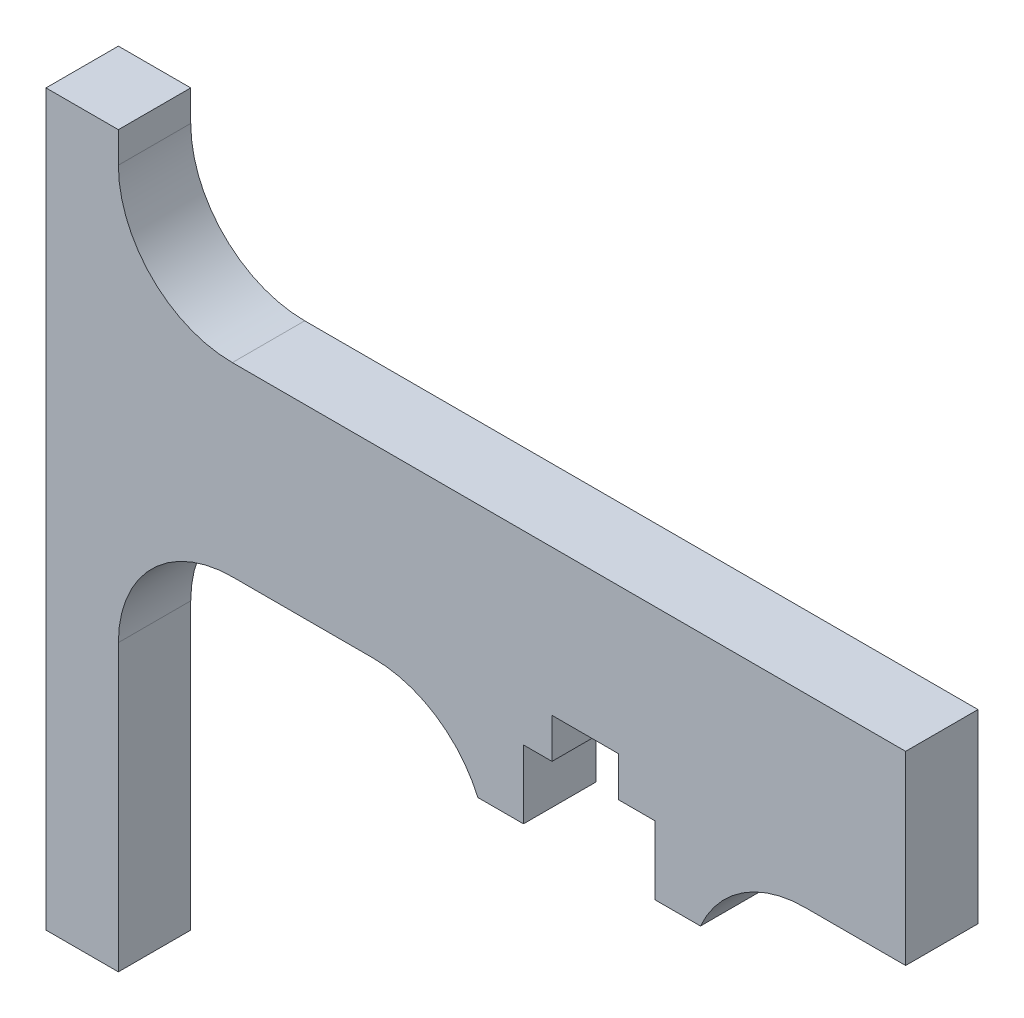
ISO-10303-21;
HEADER;
FILE_DESCRIPTION(('STEP AP214'),'2;1');
FILE_NAME('part.step','',(''),(''),'','','');
FILE_SCHEMA(('AUTOMOTIVE_DESIGN { 1 0 10303 214 1 1 1 1 }'));
ENDSEC;
DATA;
#1=APPLICATION_CONTEXT('core data for automotive mechanical design processes');
#2=APPLICATION_PROTOCOL_DEFINITION('international standard','automotive_design',2000,#1);
#3=PRODUCT_CONTEXT('',#1,'mechanical');
#4=PRODUCT('Part','Part','',(#3));
#5=PRODUCT_RELATED_PRODUCT_CATEGORY('part','',(#4));
#6=PRODUCT_DEFINITION_FORMATION('','',#4);
#7=PRODUCT_DEFINITION_CONTEXT('part definition',#1,'design');
#8=PRODUCT_DEFINITION('design','',#6,#7);
#9=PRODUCT_DEFINITION_SHAPE('','',#8);
#10=(LENGTH_UNIT() NAMED_UNIT(*) SI_UNIT(.MILLI.,.METRE.));
#11=(NAMED_UNIT(*) PLANE_ANGLE_UNIT() SI_UNIT($,.RADIAN.));
#12=(NAMED_UNIT(*) SI_UNIT($,.STERADIAN.) SOLID_ANGLE_UNIT());
#13=UNCERTAINTY_MEASURE_WITH_UNIT(LENGTH_MEASURE(1.E-05),#10,'distance_accuracy_value','');
#14=(GEOMETRIC_REPRESENTATION_CONTEXT(3) GLOBAL_UNCERTAINTY_ASSIGNED_CONTEXT((#13)) GLOBAL_UNIT_ASSIGNED_CONTEXT((#10,
#11,#12)) REPRESENTATION_CONTEXT('',''));
#15=CARTESIAN_POINT('',(0.,0.,0.));
#16=DIRECTION('',(0.,0.,1.));
#17=DIRECTION('',(1.,0.,0.));
#18=AXIS2_PLACEMENT_3D('',#15,#16,#17);
#19=CARTESIAN_POINT('',(75.42710801,-28.978,6.35));
#20=DIRECTION('',(0.,1.,0.));
#21=DIRECTION('',(-1.,0.,0.));
#22=AXIS2_PLACEMENT_3D('',#19,#20,#21);
#23=PLANE('',#22);
#24=DIRECTION('',(1.,0.,0.));
#25=VECTOR('',#24,1.);
#26=CARTESIAN_POINT('',(75.42710801,-28.978,6.35));
#27=LINE('',#26,#25);
#28=CARTESIAN_POINT('',(50.25060801,-28.978,6.35));
#29=VERTEX_POINT('',#28);
#30=CARTESIAN_POINT('',(53.42710801,-28.978,6.35));
#31=VERTEX_POINT('',#30);
#32=EDGE_CURVE('E200',#29,#31,#27,.T.);
#33=ORIENTED_EDGE('',*,*,#32,.F.);
#34=DIRECTION('',(0.,0.,-1.));
#35=VECTOR('',#34,1.);
#36=CARTESIAN_POINT('',(50.25060801,-28.978,10.));
#37=LINE('',#36,#35);
#38=CARTESIAN_POINT('',(50.25060801,-28.978,0.));
#39=VERTEX_POINT('',#38);
#40=EDGE_CURVE('E185',#29,#39,#37,.T.);
#41=ORIENTED_EDGE('',*,*,#40,.T.);
#42=DIRECTION('',(1.,0.,0.));
#43=VECTOR('',#42,1.);
#44=CARTESIAN_POINT('',(75.42710801,-28.978,0.));
#45=LINE('',#44,#43);
#46=CARTESIAN_POINT('',(53.42710801,-28.978,0.));
#47=VERTEX_POINT('',#46);
#48=EDGE_CURVE('E198',#39,#47,#45,.T.);
#49=ORIENTED_EDGE('',*,*,#48,.T.);
#50=DIRECTION('',(0.,0.,-1.));
#51=VECTOR('',#50,1.);
#52=CARTESIAN_POINT('',(53.42710801,-28.978,6.35));
#53=LINE('',#52,#51);
#54=EDGE_CURVE('E591',#31,#47,#53,.T.);
#55=ORIENTED_EDGE('',*,*,#54,.F.);
#56=EDGE_LOOP('',(#33,#41,#49,#55));
#57=FACE_BOUND('',#56,.T.);
#58=ADVANCED_FACE('F32',(#57),#23,.F.);
#59=CARTESIAN_POINT('',(41.89710801,-28.978,0.));
#60=VERTEX_POINT('',#59);
#61=CARTESIAN_POINT('',(44.40060801,-28.978,0.));
#62=VERTEX_POINT('',#61);
#63=EDGE_CURVE('E208',#60,#62,#45,.T.);
#64=ORIENTED_EDGE('',*,*,#63,.T.);
#65=DIRECTION('',(0.,0.,-1.));
#66=VECTOR('',#65,1.);
#67=CARTESIAN_POINT('',(44.40060801,-28.978,10.));
#68=LINE('',#67,#66);
#69=CARTESIAN_POINT('',(44.40060801,-28.978,6.35));
#70=VERTEX_POINT('',#69);
#71=EDGE_CURVE('E47',#70,#62,#68,.T.);
#72=ORIENTED_EDGE('',*,*,#71,.F.);
#73=CARTESIAN_POINT('',(41.89710801,-28.978,6.35));
#74=VERTEX_POINT('',#73);
#75=EDGE_CURVE('E312',#74,#70,#27,.T.);
#76=ORIENTED_EDGE('',*,*,#75,.F.);
#77=DIRECTION('',(0.,0.,-1.));
#78=VECTOR('',#77,1.);
#79=CARTESIAN_POINT('',(41.89710801,-28.978,6.35));
#80=LINE('',#79,#78);
#81=EDGE_CURVE('E294',#74,#60,#80,.T.);
#82=ORIENTED_EDGE('',*,*,#81,.T.);
#83=EDGE_LOOP('',(#64,#72,#76,#82));
#84=FACE_BOUND('',#83,.T.);
#85=ADVANCED_FACE('F338',(#84),#23,.F.);
#86=CARTESIAN_POINT('',(16.35,-28.978,0.));
#87=VERTEX_POINT('',#86);
#88=CARTESIAN_POINT('',(28.7319566200883,-28.978,0.));
#89=VERTEX_POINT('',#88);
#90=EDGE_CURVE('E211',#87,#89,#45,.T.);
#91=ORIENTED_EDGE('',*,*,#90,.T.);
#92=DIRECTION('',(0.,0.,1.));
#93=VECTOR('',#92,1.);
#94=CARTESIAN_POINT('',(28.7319566200883,-28.978,6.35));
#95=LINE('',#94,#93);
#96=CARTESIAN_POINT('',(28.7319566200883,-28.978,6.35));
#97=VERTEX_POINT('',#96);
#98=EDGE_CURVE('E55',#89,#97,#95,.T.);
#99=ORIENTED_EDGE('',*,*,#98,.T.);
#100=CARTESIAN_POINT('',(16.35,-28.978,6.35));
#101=VERTEX_POINT('',#100);
#102=EDGE_CURVE('E309',#101,#97,#27,.T.);
#103=ORIENTED_EDGE('',*,*,#102,.F.);
#104=DIRECTION('',(0.,0.,-1.));
#105=VECTOR('',#104,1.);
#106=CARTESIAN_POINT('',(16.35,-28.978,0.));
#107=LINE('',#106,#105);
#108=EDGE_CURVE('E257',#101,#87,#107,.T.);
#109=ORIENTED_EDGE('',*,*,#108,.T.);
#110=EDGE_LOOP('',(#91,#99,#103,#109));
#111=FACE_BOUND('',#110,.T.);
#112=ADVANCED_FACE('F335',(#111),#23,.F.);
#113=CARTESIAN_POINT('',(6.35000000000002,-63.9998,6.35));
#114=DIRECTION('',(0.,1.,0.));
#115=DIRECTION('',(0.,0.,1.));
#116=AXIS2_PLACEMENT_3D('',#113,#114,#115);
#117=PLANE('',#116);
#118=DIRECTION('',(1.,0.,0.));
#119=VECTOR('',#118,1.);
#120=CARTESIAN_POINT('',(6.35000000000002,-63.9998,0.));
#121=LINE('',#120,#119);
#122=CARTESIAN_POINT('',(0.,-63.9998,0.));
#123=VERTEX_POINT('',#122);
#124=CARTESIAN_POINT('',(6.35000000000002,-63.9998,0.));
#125=VERTEX_POINT('',#124);
#126=EDGE_CURVE('E290',#123,#125,#121,.T.);
#127=ORIENTED_EDGE('',*,*,#126,.T.);
#128=DIRECTION('',(0.,0.,-1.));
#129=VECTOR('',#128,1.);
#130=CARTESIAN_POINT('',(6.35000000000002,-63.9998,6.35));
#131=LINE('',#130,#129);
#132=CARTESIAN_POINT('',(6.35000000000002,-63.9998,6.35));
#133=VERTEX_POINT('',#132);
#134=EDGE_CURVE('E246',#133,#125,#131,.T.);
#135=ORIENTED_EDGE('',*,*,#134,.F.);
#136=DIRECTION('',(1.,0.,0.));
#137=VECTOR('',#136,1.);
#138=CARTESIAN_POINT('',(6.35000000000002,-63.9998,6.35));
#139=LINE('',#138,#137);
#140=CARTESIAN_POINT('',(0.,-63.9998,6.35));
#141=VERTEX_POINT('',#140);
#142=EDGE_CURVE('E303',#141,#133,#139,.T.);
#143=ORIENTED_EDGE('',*,*,#142,.F.);
#144=DIRECTION('',(0.,0.,-1.));
#145=VECTOR('',#144,1.);
#146=CARTESIAN_POINT('',(0.,-63.9998,6.35));
#147=LINE('',#146,#145);
#148=EDGE_CURVE('E249',#141,#123,#147,.T.);
#149=ORIENTED_EDGE('',*,*,#148,.T.);
#150=EDGE_LOOP('',(#127,#135,#143,#149));
#151=FACE_BOUND('',#150,.T.);
#152=ADVANCED_FACE('F337',(#151),#117,.F.);
#153=CARTESIAN_POINT('',(6.35,-28.978,6.35));
#154=DIRECTION('',(-1.,0.,0.));
#155=DIRECTION('',(0.,-1.,0.));
#156=AXIS2_PLACEMENT_3D('',#153,#154,#155);
#157=PLANE('',#156);
#158=DIRECTION('',(0.,1.,0.));
#159=VECTOR('',#158,1.);
#160=CARTESIAN_POINT('',(6.35,-28.978,0.));
#161=LINE('',#160,#159);
#162=CARTESIAN_POINT('',(6.35000000000001,-38.978,0.));
#163=VERTEX_POINT('',#162);
#164=EDGE_CURVE('E213',#125,#163,#161,.T.);
#165=ORIENTED_EDGE('',*,*,#164,.T.);
#166=DIRECTION('',(0.,0.,-1.));
#167=VECTOR('',#166,1.);
#168=CARTESIAN_POINT('',(6.35000000000001,-38.978,6.35));
#169=LINE('',#168,#167);
#170=CARTESIAN_POINT('',(6.35000000000001,-38.978,6.35));
#171=VERTEX_POINT('',#170);
#172=EDGE_CURVE('E259',#163,#171,#169,.F.);
#173=ORIENTED_EDGE('',*,*,#172,.T.);
#174=DIRECTION('',(0.,1.,0.));
#175=VECTOR('',#174,1.);
#176=CARTESIAN_POINT('',(6.35,-28.978,6.35));
#177=LINE('',#176,#175);
#178=EDGE_CURVE('E305',#133,#171,#177,.T.);
#179=ORIENTED_EDGE('',*,*,#178,.F.);
#180=ORIENTED_EDGE('',*,*,#134,.T.);
#181=EDGE_LOOP('',(#165,#173,#179,#180));
#182=FACE_BOUND('',#181,.T.);
#183=ADVANCED_FACE('F324',(#182),#157,.F.);
#184=CARTESIAN_POINT('',(66.5922593999117,-28.978,6.35));
#185=VERTEX_POINT('',#184);
#186=CARTESIAN_POINT('',(75.42710801,-28.978,6.35));
#187=VERTEX_POINT('',#186);
#188=EDGE_CURVE('E308',#185,#187,#27,.T.);
#189=ORIENTED_EDGE('',*,*,#188,.F.);
#190=DIRECTION('',(0.,0.,-1.));
#191=VECTOR('',#190,1.);
#192=CARTESIAN_POINT('',(66.5922593999117,-28.978,6.35));
#193=LINE('',#192,#191);
#194=CARTESIAN_POINT('',(66.5922593999117,-28.978,0.));
#195=VERTEX_POINT('',#194);
#196=EDGE_CURVE('E269',#185,#195,#193,.T.);
#197=ORIENTED_EDGE('',*,*,#196,.T.);
#198=CARTESIAN_POINT('',(75.42710801,-28.978,0.));
#199=VERTEX_POINT('',#198);
#200=EDGE_CURVE('E209',#195,#199,#45,.T.);
#201=ORIENTED_EDGE('',*,*,#200,.T.);
#202=DIRECTION('',(0.,0.,-1.));
#203=VECTOR('',#202,1.);
#204=CARTESIAN_POINT('',(75.42710801,-28.978,6.35));
#205=LINE('',#204,#203);
#206=EDGE_CURVE('E244',#187,#199,#205,.T.);
#207=ORIENTED_EDGE('',*,*,#206,.F.);
#208=EDGE_LOOP('',(#189,#197,#201,#207));
#209=FACE_BOUND('',#208,.T.);
#210=ADVANCED_FACE('F340',(#209),#23,.F.);
#211=CARTESIAN_POINT('',(75.42710801,-12.7,6.35));
#212=DIRECTION('',(-1.,0.,0.));
#213=DIRECTION('',(0.,-1.,0.));
#214=AXIS2_PLACEMENT_3D('',#211,#212,#213);
#215=PLANE('',#214);
#216=DIRECTION('',(0.,1.,0.));
#217=VECTOR('',#216,1.);
#218=CARTESIAN_POINT('',(75.42710801,-12.7,0.));
#219=LINE('',#218,#217);
#220=CARTESIAN_POINT('',(75.42710801,-12.7,0.));
#221=VERTEX_POINT('',#220);
#222=EDGE_CURVE('E216',#199,#221,#219,.T.);
#223=ORIENTED_EDGE('',*,*,#222,.T.);
#224=DIRECTION('',(0.,0.,-1.));
#225=VECTOR('',#224,1.);
#226=CARTESIAN_POINT('',(75.42710801,-12.7,6.35));
#227=LINE('',#226,#225);
#228=CARTESIAN_POINT('',(75.42710801,-12.7,6.35));
#229=VERTEX_POINT('',#228);
#230=EDGE_CURVE('E242',#229,#221,#227,.T.);
#231=ORIENTED_EDGE('',*,*,#230,.F.);
#232=DIRECTION('',(0.,1.,0.));
#233=VECTOR('',#232,1.);
#234=CARTESIAN_POINT('',(75.42710801,-12.7,6.35));
#235=LINE('',#234,#233);
#236=EDGE_CURVE('E311',#187,#229,#235,.T.);
#237=ORIENTED_EDGE('',*,*,#236,.F.);
#238=ORIENTED_EDGE('',*,*,#206,.T.);
#239=EDGE_LOOP('',(#223,#231,#237,#238));
#240=FACE_BOUND('',#239,.T.);
#241=ADVANCED_FACE('F352',(#240),#215,.F.);
#242=CARTESIAN_POINT('',(6.34999999999999,-12.7,6.35));
#243=DIRECTION('',(0.,-1.,0.));
#244=DIRECTION('',(1.,0.,0.));
#245=AXIS2_PLACEMENT_3D('',#242,#243,#244);
#246=PLANE('',#245);
#247=DIRECTION('',(-1.,0.,0.));
#248=VECTOR('',#247,1.);
#249=CARTESIAN_POINT('',(6.34999999999999,-12.7,0.));
#250=LINE('',#249,#248);
#251=CARTESIAN_POINT('',(16.35,-12.7,0.));
#252=VERTEX_POINT('',#251);
#253=EDGE_CURVE('E219',#221,#252,#250,.T.);
#254=ORIENTED_EDGE('',*,*,#253,.T.);
#255=DIRECTION('',(0.,0.,-1.));
#256=VECTOR('',#255,1.);
#257=CARTESIAN_POINT('',(16.35,-12.7,6.35));
#258=LINE('',#257,#256);
#259=CARTESIAN_POINT('',(16.35,-12.7,6.35));
#260=VERTEX_POINT('',#259);
#261=EDGE_CURVE('E255',#252,#260,#258,.F.);
#262=ORIENTED_EDGE('',*,*,#261,.T.);
#263=DIRECTION('',(-1.,0.,0.));
#264=VECTOR('',#263,1.);
#265=CARTESIAN_POINT('',(6.34999999999999,-12.7,6.35));
#266=LINE('',#265,#264);
#267=EDGE_CURVE('E314',#229,#260,#266,.T.);
#268=ORIENTED_EDGE('',*,*,#267,.F.);
#269=ORIENTED_EDGE('',*,*,#230,.T.);
#270=EDGE_LOOP('',(#254,#262,#268,#269));
#271=FACE_BOUND('',#270,.T.);
#272=ADVANCED_FACE('F444',(#271),#246,.F.);
#273=CARTESIAN_POINT('',(6.34999999999999,0.,6.35));
#274=DIRECTION('',(-1.,0.,0.));
#275=DIRECTION('',(0.,-1.,0.));
#276=AXIS2_PLACEMENT_3D('',#273,#274,#275);
#277=PLANE('',#276);
#278=DIRECTION('',(0.,1.,0.));
#279=VECTOR('',#278,1.);
#280=CARTESIAN_POINT('',(6.34999999999999,0.,6.35));
#281=LINE('',#280,#279);
#282=CARTESIAN_POINT('',(6.34999999999999,-2.7,6.35));
#283=VERTEX_POINT('',#282);
#284=CARTESIAN_POINT('',(6.34999999999999,0.,6.35));
#285=VERTEX_POINT('',#284);
#286=EDGE_CURVE('E317',#283,#285,#281,.T.);
#287=ORIENTED_EDGE('',*,*,#286,.F.);
#288=DIRECTION('',(0.,0.,-1.));
#289=VECTOR('',#288,1.);
#290=CARTESIAN_POINT('',(6.34999999999999,-2.7,0.));
#291=LINE('',#290,#289);
#292=CARTESIAN_POINT('',(6.34999999999999,-2.7,0.));
#293=VERTEX_POINT('',#292);
#294=EDGE_CURVE('E252',#283,#293,#291,.T.);
#295=ORIENTED_EDGE('',*,*,#294,.T.);
#296=DIRECTION('',(0.,1.,0.));
#297=VECTOR('',#296,1.);
#298=CARTESIAN_POINT('',(6.34999999999999,0.,0.));
#299=LINE('',#298,#297);
#300=CARTESIAN_POINT('',(6.34999999999999,0.,0.));
#301=VERTEX_POINT('',#300);
#302=EDGE_CURVE('E226',#293,#301,#299,.T.);
#303=ORIENTED_EDGE('',*,*,#302,.T.);
#304=DIRECTION('',(0.,0.,-1.));
#305=VECTOR('',#304,1.);
#306=CARTESIAN_POINT('',(6.34999999999999,0.,6.35));
#307=LINE('',#306,#305);
#308=EDGE_CURVE('E238',#285,#301,#307,.T.);
#309=ORIENTED_EDGE('',*,*,#308,.F.);
#310=EDGE_LOOP('',(#287,#295,#303,#309));
#311=FACE_BOUND('',#310,.T.);
#312=ADVANCED_FACE('F440',(#311),#277,.F.);
#313=CARTESIAN_POINT('',(0.,0.,6.35));
#314=DIRECTION('',(0.,-1.,0.));
#315=DIRECTION('',(0.,0.,-1.));
#316=AXIS2_PLACEMENT_3D('',#313,#314,#315);
#317=PLANE('',#316);
#318=DIRECTION('',(-1.,0.,0.));
#319=VECTOR('',#318,1.);
#320=CARTESIAN_POINT('',(0.,0.,0.));
#321=LINE('',#320,#319);
#322=CARTESIAN_POINT('',(0.,0.,0.));
#323=VERTEX_POINT('',#322);
#324=EDGE_CURVE('E230',#301,#323,#321,.T.);
#325=ORIENTED_EDGE('',*,*,#324,.T.);
#326=DIRECTION('',(0.,0.,-1.));
#327=VECTOR('',#326,1.);
#328=CARTESIAN_POINT('',(0.,0.,6.35));
#329=LINE('',#328,#327);
#330=CARTESIAN_POINT('',(0.,0.,6.35));
#331=VERTEX_POINT('',#330);
#332=EDGE_CURVE('E235',#331,#323,#329,.T.);
#333=ORIENTED_EDGE('',*,*,#332,.F.);
#334=DIRECTION('',(-1.,0.,0.));
#335=VECTOR('',#334,1.);
#336=CARTESIAN_POINT('',(0.,0.,6.35));
#337=LINE('',#336,#335);
#338=EDGE_CURVE('E239',#285,#331,#337,.T.);
#339=ORIENTED_EDGE('',*,*,#338,.F.);
#340=ORIENTED_EDGE('',*,*,#308,.T.);
#341=EDGE_LOOP('',(#325,#333,#339,#340));
#342=FACE_BOUND('',#341,.T.);
#343=ADVANCED_FACE('F436',(#342),#317,.F.);
#344=CARTESIAN_POINT('',(0.,-45.001477479758,6.35));
#345=DIRECTION('',(1.,0.,0.));
#346=DIRECTION('',(0.,0.,-1.));
#347=AXIS2_PLACEMENT_3D('',#344,#345,#346);
#348=PLANE('',#347);
#349=DIRECTION('',(0.,-1.,0.));
#350=VECTOR('',#349,1.);
#351=CARTESIAN_POINT('',(0.,-45.001477479758,0.));
#352=LINE('',#351,#350);
#353=EDGE_CURVE('E232',#323,#123,#352,.T.);
#354=ORIENTED_EDGE('',*,*,#353,.T.);
#355=ORIENTED_EDGE('',*,*,#148,.F.);
#356=DIRECTION('',(0.,-1.,0.));
#357=VECTOR('',#356,1.);
#358=CARTESIAN_POINT('',(0.,-63.9998,6.35));
#359=LINE('',#358,#357);
#360=EDGE_CURVE('E234',#331,#141,#359,.T.);
#361=ORIENTED_EDGE('',*,*,#360,.F.);
#362=ORIENTED_EDGE('',*,*,#332,.T.);
#363=EDGE_LOOP('',(#354,#355,#361,#362));
#364=FACE_BOUND('',#363,.T.);
#365=ADVANCED_FACE('F375',(#364),#348,.F.);
#366=CARTESIAN_POINT('',(0.,0.,6.35));
#367=DIRECTION('',(0.,0.,-1.));
#368=DIRECTION('',(-1.,0.,0.));
#369=AXIS2_PLACEMENT_3D('',#366,#367,#368);
#370=PLANE('',#369);
#371=DIRECTION('',(1.,0.,0.));
#372=VECTOR('',#371,1.);
#373=CARTESIAN_POINT('',(0.,-25.478,6.35));
#374=LINE('',#373,#372);
#375=CARTESIAN_POINT('',(44.40060801,-25.478,6.35));
#376=VERTEX_POINT('',#375);
#377=CARTESIAN_POINT('',(50.25060801,-25.478,6.35));
#378=VERTEX_POINT('',#377);
#379=EDGE_CURVE('E603',#376,#378,#374,.T.);
#380=ORIENTED_EDGE('',*,*,#379,.T.);
#381=DIRECTION('',(0.,-1.,0.));
#382=VECTOR('',#381,1.);
#383=CARTESIAN_POINT('',(50.25060801,0.,6.35));
#384=LINE('',#383,#382);
#385=EDGE_CURVE('E598',#378,#29,#384,.T.);
#386=ORIENTED_EDGE('',*,*,#385,.T.);
#387=ORIENTED_EDGE('',*,*,#32,.T.);
#388=DIRECTION('',(0.,1.,0.));
#389=VECTOR('',#388,1.);
#390=CARTESIAN_POINT('',(53.42710801,-28.978,6.35));
#391=LINE('',#390,#389);
#392=CARTESIAN_POINT('',(53.42710801,-34.978,6.35));
#393=VERTEX_POINT('',#392);
#394=EDGE_CURVE('E596',#393,#31,#391,.T.);
#395=ORIENTED_EDGE('',*,*,#394,.F.);
#396=DIRECTION('',(-1.,0.,0.));
#397=VECTOR('',#396,1.);
#398=CARTESIAN_POINT('',(53.42710801,-34.978,6.35));
#399=LINE('',#398,#397);
#400=CARTESIAN_POINT('',(57.42710801,-34.978,6.35));
#401=VERTEX_POINT('',#400);
#402=EDGE_CURVE('E574',#401,#393,#399,.T.);
#403=ORIENTED_EDGE('',*,*,#402,.F.);
#404=CARTESIAN_POINT('',(66.5922593999117,-38.978,6.35));
#405=DIRECTION('',(0.,0.,-1.));
#406=DIRECTION('',(-1.,0.,0.));
#407=AXIS2_PLACEMENT_3D('',#404,#405,#406);
#408=CIRCLE('',#407,10.);
#409=EDGE_CURVE('E275',#401,#185,#408,.T.);
#410=ORIENTED_EDGE('',*,*,#409,.T.);
#411=ORIENTED_EDGE('',*,*,#188,.T.);
#412=ORIENTED_EDGE('',*,*,#236,.T.);
#413=ORIENTED_EDGE('',*,*,#267,.T.);
#414=CARTESIAN_POINT('',(16.35,-2.7,6.35));
#415=DIRECTION('',(0.,0.,-1.));
#416=DIRECTION('',(-1.,0.,0.));
#417=AXIS2_PLACEMENT_3D('',#414,#415,#416);
#418=CIRCLE('',#417,10.);
#419=EDGE_CURVE('E263',#260,#283,#418,.T.);
#420=ORIENTED_EDGE('',*,*,#419,.T.);
#421=ORIENTED_EDGE('',*,*,#286,.T.);
#422=ORIENTED_EDGE('',*,*,#338,.T.);
#423=ORIENTED_EDGE('',*,*,#360,.T.);
#424=ORIENTED_EDGE('',*,*,#142,.T.);
#425=ORIENTED_EDGE('',*,*,#178,.T.);
#426=CARTESIAN_POINT('',(16.35,-38.978,6.35));
#427=DIRECTION('',(0.,0.,-1.));
#428=DIRECTION('',(-1.,0.,0.));
#429=AXIS2_PLACEMENT_3D('',#426,#427,#428);
#430=CIRCLE('',#429,10.);
#431=EDGE_CURVE('E267',#171,#101,#430,.T.);
#432=ORIENTED_EDGE('',*,*,#431,.T.);
#433=ORIENTED_EDGE('',*,*,#102,.T.);
#434=CARTESIAN_POINT('',(28.7319566200883,-38.978,6.35));
#435=DIRECTION('',(0.,0.,-1.));
#436=DIRECTION('',(-1.,0.,0.));
#437=AXIS2_PLACEMENT_3D('',#434,#435,#436);
#438=CIRCLE('',#437,10.);
#439=CARTESIAN_POINT('',(37.89710801,-34.978,6.35));
#440=VERTEX_POINT('',#439);
#441=EDGE_CURVE('E11',#97,#440,#438,.T.);
#442=ORIENTED_EDGE('',*,*,#441,.T.);
#443=DIRECTION('',(-1.,0.,0.));
#444=VECTOR('',#443,1.);
#445=CARTESIAN_POINT('',(37.89710801,-34.978,6.35));
#446=LINE('',#445,#444);
#447=CARTESIAN_POINT('',(41.89710801,-34.978,6.35));
#448=VERTEX_POINT('',#447);
#449=EDGE_CURVE('E289',#448,#440,#446,.T.);
#450=ORIENTED_EDGE('',*,*,#449,.F.);
#451=DIRECTION('',(0.,-1.,0.));
#452=VECTOR('',#451,1.);
#453=CARTESIAN_POINT('',(41.89710801,-28.978,6.35));
#454=LINE('',#453,#452);
#455=EDGE_CURVE('E582',#74,#448,#454,.T.);
#456=ORIENTED_EDGE('',*,*,#455,.F.);
#457=ORIENTED_EDGE('',*,*,#75,.T.);
#458=DIRECTION('',(0.,1.,0.));
#459=VECTOR('',#458,1.);
#460=CARTESIAN_POINT('',(44.40060801,0.,6.35));
#461=LINE('',#460,#459);
#462=EDGE_CURVE('E580',#70,#376,#461,.T.);
#463=ORIENTED_EDGE('',*,*,#462,.T.);
#464=EDGE_LOOP('',(#380,#386,#387,#395,#403,#410,#411,#412,#413,#420,#421,#422,#423,#424,#425,
#432,#433,#442,#450,#456,#457,#463));
#465=FACE_BOUND('',#464,.T.);
#466=ADVANCED_FACE('F334',(#465),#370,.F.);
#467=CARTESIAN_POINT('',(0.,0.,0.));
#468=DIRECTION('',(0.,0.,-1.));
#469=DIRECTION('',(-1.,0.,0.));
#470=AXIS2_PLACEMENT_3D('',#467,#468,#469);
#471=PLANE('',#470);
#472=DIRECTION('',(0.,-1.,0.));
#473=VECTOR('',#472,1.);
#474=CARTESIAN_POINT('',(50.25060801,-28.978,0.));
#475=LINE('',#474,#473);
#476=CARTESIAN_POINT('',(50.25060801,-25.478,0.));
#477=VERTEX_POINT('',#476);
#478=EDGE_CURVE('E182',#477,#39,#475,.T.);
#479=ORIENTED_EDGE('',*,*,#478,.F.);
#480=DIRECTION('',(1.,0.,0.));
#481=VECTOR('',#480,1.);
#482=CARTESIAN_POINT('',(50.25060801,-25.478,0.));
#483=LINE('',#482,#481);
#484=CARTESIAN_POINT('',(44.40060801,-25.478,0.));
#485=VERTEX_POINT('',#484);
#486=EDGE_CURVE('E201',#485,#477,#483,.T.);
#487=ORIENTED_EDGE('',*,*,#486,.F.);
#488=DIRECTION('',(0.,1.,0.));
#489=VECTOR('',#488,1.);
#490=CARTESIAN_POINT('',(44.40060801,-28.978,0.));
#491=LINE('',#490,#489);
#492=EDGE_CURVE('E193',#62,#485,#491,.T.);
#493=ORIENTED_EDGE('',*,*,#492,.F.);
#494=ORIENTED_EDGE('',*,*,#63,.F.);
#495=DIRECTION('',(0.,-1.,0.));
#496=VECTOR('',#495,1.);
#497=CARTESIAN_POINT('',(41.89710801,-28.978,0.));
#498=LINE('',#497,#496);
#499=CARTESIAN_POINT('',(41.89710801,-34.978,0.));
#500=VERTEX_POINT('',#499);
#501=EDGE_CURVE('E585',#60,#500,#498,.T.);
#502=ORIENTED_EDGE('',*,*,#501,.T.);
#503=DIRECTION('',(-1.,0.,0.));
#504=VECTOR('',#503,1.);
#505=CARTESIAN_POINT('',(37.89710801,-34.978,0.));
#506=LINE('',#505,#504);
#507=CARTESIAN_POINT('',(37.89710801,-34.978,0.));
#508=VERTEX_POINT('',#507);
#509=EDGE_CURVE('E279',#500,#508,#506,.T.);
#510=ORIENTED_EDGE('',*,*,#509,.T.);
#511=CARTESIAN_POINT('',(28.7319566200883,-38.978,0.));
#512=DIRECTION('',(0.,0.,-1.));
#513=DIRECTION('',(-1.,0.,0.));
#514=AXIS2_PLACEMENT_3D('',#511,#512,#513);
#515=CIRCLE('',#514,10.);
#516=EDGE_CURVE('E40',#508,#89,#515,.F.);
#517=ORIENTED_EDGE('',*,*,#516,.T.);
#518=ORIENTED_EDGE('',*,*,#90,.F.);
#519=CARTESIAN_POINT('',(16.35,-38.978,0.));
#520=DIRECTION('',(0.,0.,-1.));
#521=DIRECTION('',(-1.,0.,0.));
#522=AXIS2_PLACEMENT_3D('',#519,#520,#521);
#523=CIRCLE('',#522,10.);
#524=EDGE_CURVE('E265',#87,#163,#523,.F.);
#525=ORIENTED_EDGE('',*,*,#524,.T.);
#526=ORIENTED_EDGE('',*,*,#164,.F.);
#527=ORIENTED_EDGE('',*,*,#126,.F.);
#528=ORIENTED_EDGE('',*,*,#353,.F.);
#529=ORIENTED_EDGE('',*,*,#324,.F.);
#530=ORIENTED_EDGE('',*,*,#302,.F.);
#531=CARTESIAN_POINT('',(16.35,-2.7,0.));
#532=DIRECTION('',(0.,0.,-1.));
#533=DIRECTION('',(-1.,0.,0.));
#534=AXIS2_PLACEMENT_3D('',#531,#532,#533);
#535=CIRCLE('',#534,10.);
#536=EDGE_CURVE('E261',#293,#252,#535,.F.);
#537=ORIENTED_EDGE('',*,*,#536,.T.);
#538=ORIENTED_EDGE('',*,*,#253,.F.);
#539=ORIENTED_EDGE('',*,*,#222,.F.);
#540=ORIENTED_EDGE('',*,*,#200,.F.);
#541=CARTESIAN_POINT('',(66.5922593999117,-38.978,0.));
#542=DIRECTION('',(0.,0.,-1.));
#543=DIRECTION('',(-1.,0.,0.));
#544=AXIS2_PLACEMENT_3D('',#541,#542,#543);
#545=CIRCLE('',#544,10.);
#546=CARTESIAN_POINT('',(57.42710801,-34.978,0.));
#547=VERTEX_POINT('',#546);
#548=EDGE_CURVE('E273',#195,#547,#545,.F.);
#549=ORIENTED_EDGE('',*,*,#548,.T.);
#550=DIRECTION('',(-1.,0.,0.));
#551=VECTOR('',#550,1.);
#552=CARTESIAN_POINT('',(53.42710801,-34.978,0.));
#553=LINE('',#552,#551);
#554=CARTESIAN_POINT('',(53.42710801,-34.978,0.));
#555=VERTEX_POINT('',#554);
#556=EDGE_CURVE('E594',#547,#555,#553,.T.);
#557=ORIENTED_EDGE('',*,*,#556,.T.);
#558=DIRECTION('',(0.,1.,0.));
#559=VECTOR('',#558,1.);
#560=CARTESIAN_POINT('',(53.42710801,-28.978,0.));
#561=LINE('',#560,#559);
#562=EDGE_CURVE('E207',#555,#47,#561,.T.);
#563=ORIENTED_EDGE('',*,*,#562,.T.);
#564=ORIENTED_EDGE('',*,*,#48,.F.);
#565=EDGE_LOOP('',(#479,#487,#493,#494,#502,#510,#517,#518,#525,#526,#527,#528,#529,#530,#537,
#538,#539,#540,#549,#557,#563,#564));
#566=FACE_BOUND('',#565,.T.);
#567=ADVANCED_FACE('F204',(#566),#471,.T.);
#568=CARTESIAN_POINT('',(16.35,-2.7,6.35));
#569=DIRECTION('',(0.,0.,1.));
#570=DIRECTION('',(1.,0.,0.));
#571=AXIS2_PLACEMENT_3D('',#568,#569,#570);
#572=CYLINDRICAL_SURFACE('',#571,10.);
#573=ORIENTED_EDGE('',*,*,#419,.F.);
#574=ORIENTED_EDGE('',*,*,#261,.F.);
#575=ORIENTED_EDGE('',*,*,#536,.F.);
#576=ORIENTED_EDGE('',*,*,#294,.F.);
#577=EDGE_LOOP('',(#573,#574,#575,#576));
#578=FACE_BOUND('',#577,.T.);
#579=ADVANCED_FACE('F385',(#578),#572,.F.);
#580=CARTESIAN_POINT('',(16.35,-38.978,6.35));
#581=DIRECTION('',(0.,0.,1.));
#582=DIRECTION('',(1.,0.,0.));
#583=AXIS2_PLACEMENT_3D('',#580,#581,#582);
#584=CYLINDRICAL_SURFACE('',#583,10.);
#585=ORIENTED_EDGE('',*,*,#431,.F.);
#586=ORIENTED_EDGE('',*,*,#172,.F.);
#587=ORIENTED_EDGE('',*,*,#524,.F.);
#588=ORIENTED_EDGE('',*,*,#108,.F.);
#589=EDGE_LOOP('',(#585,#586,#587,#588));
#590=FACE_BOUND('',#589,.T.);
#591=ADVANCED_FACE('F330',(#590),#584,.F.);
#592=CARTESIAN_POINT('',(37.89710801,-34.978,6.35));
#593=DIRECTION('',(0.,-1.,0.));
#594=DIRECTION('',(0.,0.,-1.));
#595=AXIS2_PLACEMENT_3D('',#592,#593,#594);
#596=PLANE('',#595);
#597=ORIENTED_EDGE('',*,*,#509,.F.);
#598=DIRECTION('',(0.,0.,-1.));
#599=VECTOR('',#598,1.);
#600=CARTESIAN_POINT('',(41.89710801,-34.978,6.35));
#601=LINE('',#600,#599);
#602=EDGE_CURVE('E291',#448,#500,#601,.T.);
#603=ORIENTED_EDGE('',*,*,#602,.F.);
#604=ORIENTED_EDGE('',*,*,#449,.T.);
#605=DIRECTION('',(0.,0.,-1.));
#606=VECTOR('',#605,1.);
#607=CARTESIAN_POINT('',(37.89710801,-34.978,6.35));
#608=LINE('',#607,#606);
#609=EDGE_CURVE('E284',#440,#508,#608,.T.);
#610=ORIENTED_EDGE('',*,*,#609,.T.);
#611=EDGE_LOOP('',(#597,#603,#604,#610));
#612=FACE_BOUND('',#611,.T.);
#613=ADVANCED_FACE('F287',(#612),#596,.T.);
#614=CARTESIAN_POINT('',(41.89710801,-28.978,6.35));
#615=DIRECTION('',(1.,0.,0.));
#616=DIRECTION('',(0.,0.,-1.));
#617=AXIS2_PLACEMENT_3D('',#614,#615,#616);
#618=PLANE('',#617);
#619=ORIENTED_EDGE('',*,*,#501,.F.);
#620=ORIENTED_EDGE('',*,*,#81,.F.);
#621=ORIENTED_EDGE('',*,*,#455,.T.);
#622=ORIENTED_EDGE('',*,*,#602,.T.);
#623=EDGE_LOOP('',(#619,#620,#621,#622));
#624=FACE_BOUND('',#623,.T.);
#625=ADVANCED_FACE('F427',(#624),#618,.T.);
#626=CARTESIAN_POINT('',(53.42710801,-28.978,6.35));
#627=DIRECTION('',(-1.,0.,0.));
#628=DIRECTION('',(0.,0.,1.));
#629=AXIS2_PLACEMENT_3D('',#626,#627,#628);
#630=PLANE('',#629);
#631=ORIENTED_EDGE('',*,*,#562,.F.);
#632=DIRECTION('',(0.,0.,-1.));
#633=VECTOR('',#632,1.);
#634=CARTESIAN_POINT('',(53.42710801,-34.978,6.35));
#635=LINE('',#634,#633);
#636=EDGE_CURVE('E586',#393,#555,#635,.T.);
#637=ORIENTED_EDGE('',*,*,#636,.F.);
#638=ORIENTED_EDGE('',*,*,#394,.T.);
#639=ORIENTED_EDGE('',*,*,#54,.T.);
#640=EDGE_LOOP('',(#631,#637,#638,#639));
#641=FACE_BOUND('',#640,.T.);
#642=ADVANCED_FACE('F423',(#641),#630,.T.);
#643=CARTESIAN_POINT('',(53.42710801,-34.978,6.35));
#644=DIRECTION('',(0.,-1.,0.));
#645=DIRECTION('',(1.,0.,0.));
#646=AXIS2_PLACEMENT_3D('',#643,#644,#645);
#647=PLANE('',#646);
#648=ORIENTED_EDGE('',*,*,#556,.F.);
#649=DIRECTION('',(0.,0.,-1.));
#650=VECTOR('',#649,1.);
#651=CARTESIAN_POINT('',(57.42710801,-34.978,6.35));
#652=LINE('',#651,#650);
#653=EDGE_CURVE('E568',#401,#547,#652,.T.);
#654=ORIENTED_EDGE('',*,*,#653,.F.);
#655=ORIENTED_EDGE('',*,*,#402,.T.);
#656=ORIENTED_EDGE('',*,*,#636,.T.);
#657=EDGE_LOOP('',(#648,#654,#655,#656));
#658=FACE_BOUND('',#657,.T.);
#659=ADVANCED_FACE('F419',(#658),#647,.T.);
#660=CARTESIAN_POINT('',(66.5922593999117,-38.978,6.35));
#661=DIRECTION('',(0.,0.,-1.));
#662=DIRECTION('',(-1.,0.,0.));
#663=AXIS2_PLACEMENT_3D('',#660,#661,#662);
#664=CYLINDRICAL_SURFACE('',#663,10.);
#665=ORIENTED_EDGE('',*,*,#409,.F.);
#666=ORIENTED_EDGE('',*,*,#653,.T.);
#667=ORIENTED_EDGE('',*,*,#548,.F.);
#668=ORIENTED_EDGE('',*,*,#196,.F.);
#669=EDGE_LOOP('',(#665,#666,#667,#668));
#670=FACE_BOUND('',#669,.T.);
#671=ADVANCED_FACE('F422',(#670),#664,.F.);
#672=CARTESIAN_POINT('',(28.7319566200883,-38.978,6.35));
#673=DIRECTION('',(0.,0.,1.));
#674=DIRECTION('',(1.,0.,0.));
#675=AXIS2_PLACEMENT_3D('',#672,#673,#674);
#676=CYLINDRICAL_SURFACE('',#675,10.);
#677=ORIENTED_EDGE('',*,*,#441,.F.);
#678=ORIENTED_EDGE('',*,*,#98,.F.);
#679=ORIENTED_EDGE('',*,*,#516,.F.);
#680=ORIENTED_EDGE('',*,*,#609,.F.);
#681=EDGE_LOOP('',(#677,#678,#679,#680));
#682=FACE_BOUND('',#681,.T.);
#683=ADVANCED_FACE('F34',(#682),#676,.F.);
#684=CARTESIAN_POINT('',(50.25060801,-28.978,10.));
#685=DIRECTION('',(1.,0.,0.));
#686=DIRECTION('',(0.,0.,-1.));
#687=AXIS2_PLACEMENT_3D('',#684,#685,#686);
#688=PLANE('',#687);
#689=DIRECTION('',(0.,0.,-1.));
#690=VECTOR('',#689,1.);
#691=CARTESIAN_POINT('',(50.25060801,-25.478,10.));
#692=LINE('',#691,#690);
#693=EDGE_CURVE('E188',#378,#477,#692,.T.);
#694=ORIENTED_EDGE('',*,*,#693,.T.);
#695=ORIENTED_EDGE('',*,*,#478,.T.);
#696=ORIENTED_EDGE('',*,*,#40,.F.);
#697=ORIENTED_EDGE('',*,*,#385,.F.);
#698=EDGE_LOOP('',(#694,#695,#696,#697));
#699=FACE_BOUND('',#698,.T.);
#700=ADVANCED_FACE('F184',(#699),#688,.F.);
#701=CARTESIAN_POINT('',(50.25060801,-25.478,10.));
#702=DIRECTION('',(0.,1.,0.));
#703=DIRECTION('',(0.,0.,1.));
#704=AXIS2_PLACEMENT_3D('',#701,#702,#703);
#705=PLANE('',#704);
#706=DIRECTION('',(0.,0.,-1.));
#707=VECTOR('',#706,1.);
#708=CARTESIAN_POINT('',(44.40060801,-25.478,10.));
#709=LINE('',#708,#707);
#710=EDGE_CURVE('E607',#376,#485,#709,.T.);
#711=ORIENTED_EDGE('',*,*,#710,.T.);
#712=ORIENTED_EDGE('',*,*,#486,.T.);
#713=ORIENTED_EDGE('',*,*,#693,.F.);
#714=ORIENTED_EDGE('',*,*,#379,.F.);
#715=EDGE_LOOP('',(#711,#712,#713,#714));
#716=FACE_BOUND('',#715,.T.);
#717=ADVANCED_FACE('F396',(#716),#705,.F.);
#718=CARTESIAN_POINT('',(44.40060801,-28.978,10.));
#719=DIRECTION('',(-1.,0.,0.));
#720=DIRECTION('',(0.,0.,1.));
#721=AXIS2_PLACEMENT_3D('',#718,#719,#720);
#722=PLANE('',#721);
#723=ORIENTED_EDGE('',*,*,#71,.T.);
#724=ORIENTED_EDGE('',*,*,#492,.T.);
#725=ORIENTED_EDGE('',*,*,#710,.F.);
#726=ORIENTED_EDGE('',*,*,#462,.F.);
#727=EDGE_LOOP('',(#723,#724,#725,#726));
#728=FACE_BOUND('',#727,.T.);
#729=ADVANCED_FACE('F405',(#728),#722,.F.);
#730=CLOSED_SHELL('',(#58,#85,#112,#152,#183,#210,#241,#272,#312,#343,#365,#466,#567,#579,#591,
#613,#625,#642,#659,#671,#683,#700,#717,#729));
#731=MANIFOLD_SOLID_BREP('B2',#730);
#732=ADVANCED_BREP_SHAPE_REPRESENTATION('',(#18,#731),#14);
#733=SHAPE_DEFINITION_REPRESENTATION(#9,#732);
ENDSEC;
END-ISO-10303-21;
